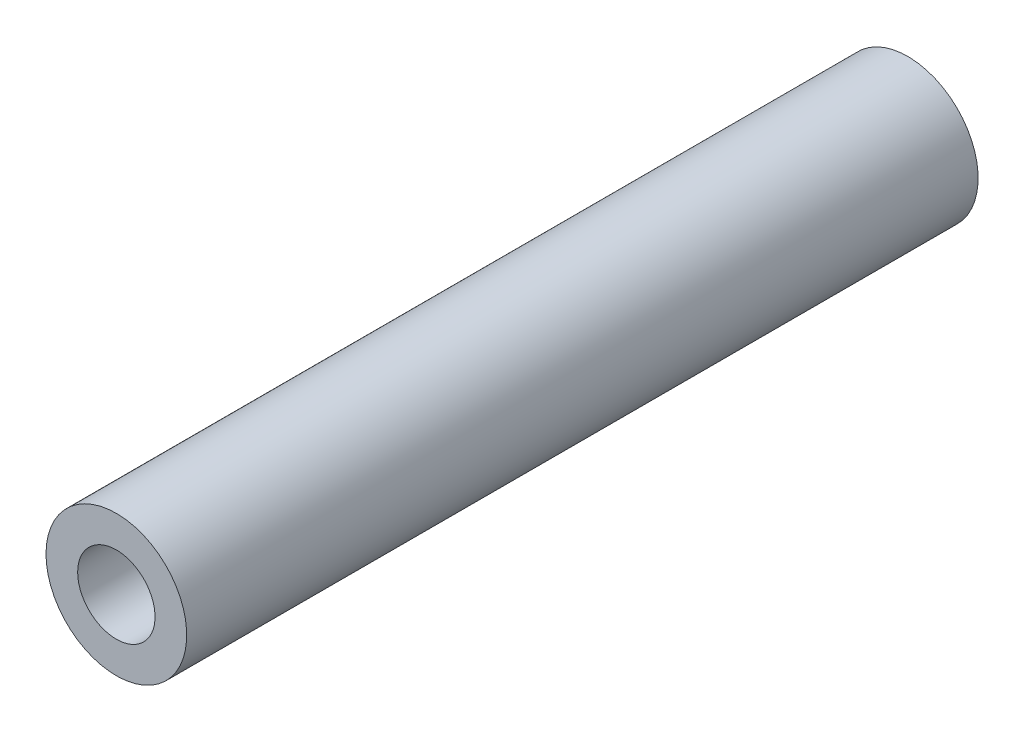
ISO-10303-21;
HEADER;
FILE_DESCRIPTION(('STEP AP214'),'2;1');
FILE_NAME('part.step','',(''),(''),'','','');
FILE_SCHEMA(('AUTOMOTIVE_DESIGN { 1 0 10303 214 1 1 1 1 }'));
ENDSEC;
DATA;
#1=APPLICATION_CONTEXT('core data for automotive mechanical design processes');
#2=APPLICATION_PROTOCOL_DEFINITION('international standard','automotive_design',2000,#1);
#3=PRODUCT_CONTEXT('',#1,'mechanical');
#4=PRODUCT('Part','Part','',(#3));
#5=PRODUCT_RELATED_PRODUCT_CATEGORY('part','',(#4));
#6=PRODUCT_DEFINITION_FORMATION('','',#4);
#7=PRODUCT_DEFINITION_CONTEXT('part definition',#1,'design');
#8=PRODUCT_DEFINITION('design','',#6,#7);
#9=PRODUCT_DEFINITION_SHAPE('','',#8);
#10=(LENGTH_UNIT() NAMED_UNIT(*) SI_UNIT(.MILLI.,.METRE.));
#11=(NAMED_UNIT(*) PLANE_ANGLE_UNIT() SI_UNIT($,.RADIAN.));
#12=(NAMED_UNIT(*) SI_UNIT($,.STERADIAN.) SOLID_ANGLE_UNIT());
#13=UNCERTAINTY_MEASURE_WITH_UNIT(LENGTH_MEASURE(1.E-05),#10,'distance_accuracy_value','');
#14=(GEOMETRIC_REPRESENTATION_CONTEXT(3) GLOBAL_UNCERTAINTY_ASSIGNED_CONTEXT((#13)) GLOBAL_UNIT_ASSIGNED_CONTEXT((#10,
#11,#12)) REPRESENTATION_CONTEXT('',''));
#15=CARTESIAN_POINT('',(0.,0.,0.));
#16=DIRECTION('',(0.,0.,1.));
#17=DIRECTION('',(1.,0.,0.));
#18=AXIS2_PLACEMENT_3D('',#15,#16,#17);
#19=CARTESIAN_POINT('',(0.,0.,45.));
#20=DIRECTION('',(0.,0.,1.));
#21=DIRECTION('',(1.,0.,0.));
#22=AXIS2_PLACEMENT_3D('',#19,#20,#21);
#23=PLANE('',#22);
#24=CARTESIAN_POINT('',(0.,0.,45.));
#25=DIRECTION('',(0.,0.,1.));
#26=DIRECTION('',(1.,0.,0.));
#27=AXIS2_PLACEMENT_3D('',#24,#25,#26);
#28=CIRCLE('',#27,4.);
#29=CARTESIAN_POINT('',(-4.,0.,45.));
#30=VERTEX_POINT('',#29);
#31=EDGE_CURVE('E10',#30,#30,#28,.T.);
#32=ORIENTED_EDGE('',*,*,#31,.T.);
#33=EDGE_LOOP('',(#32));
#34=FACE_BOUND('',#33,.T.);
#35=CARTESIAN_POINT('',(0.,0.,45.));
#36=DIRECTION('',(0.,0.,1.));
#37=DIRECTION('',(1.,0.,0.));
#38=AXIS2_PLACEMENT_3D('',#35,#36,#37);
#39=CIRCLE('',#38,2.2);
#40=CARTESIAN_POINT('',(-2.2,0.,45.));
#41=VERTEX_POINT('',#40);
#42=EDGE_CURVE('E56',#41,#41,#39,.T.);
#43=ORIENTED_EDGE('',*,*,#42,.F.);
#44=EDGE_LOOP('',(#43));
#45=FACE_BOUND('',#44,.T.);
#46=ADVANCED_FACE('F43',(#34,#45),#23,.T.);
#47=CARTESIAN_POINT('',(0.,0.,0.));
#48=DIRECTION('',(0.,0.,1.));
#49=DIRECTION('',(1.,0.,0.));
#50=AXIS2_PLACEMENT_3D('',#47,#48,#49);
#51=PLANE('',#50);
#52=CARTESIAN_POINT('',(0.,0.,0.));
#53=DIRECTION('',(0.,0.,1.));
#54=DIRECTION('',(1.,0.,0.));
#55=AXIS2_PLACEMENT_3D('',#52,#53,#54);
#56=CIRCLE('',#55,4.);
#57=CARTESIAN_POINT('',(-4.,0.,0.));
#58=VERTEX_POINT('',#57);
#59=EDGE_CURVE('E47',#58,#58,#56,.T.);
#60=ORIENTED_EDGE('',*,*,#59,.F.);
#61=EDGE_LOOP('',(#60));
#62=FACE_BOUND('',#61,.T.);
#63=CARTESIAN_POINT('',(0.,0.,0.));
#64=DIRECTION('',(0.,0.,1.));
#65=DIRECTION('',(1.,0.,0.));
#66=AXIS2_PLACEMENT_3D('',#63,#64,#65);
#67=CIRCLE('',#66,2.2);
#68=CARTESIAN_POINT('',(-2.2,0.,0.));
#69=VERTEX_POINT('',#68);
#70=EDGE_CURVE('E58',#69,#69,#67,.T.);
#71=ORIENTED_EDGE('',*,*,#70,.T.);
#72=EDGE_LOOP('',(#71));
#73=FACE_BOUND('',#72,.T.);
#74=ADVANCED_FACE('F70',(#62,#73),#51,.F.);
#75=CARTESIAN_POINT('',(0.,0.,45.));
#76=DIRECTION('',(0.,0.,-1.));
#77=DIRECTION('',(-1.,0.,0.));
#78=AXIS2_PLACEMENT_3D('',#75,#76,#77);
#79=CYLINDRICAL_SURFACE('',#78,4.);
#80=CARTESIAN_POINT('',(-4.,0.,45.));
#81=CARTESIAN_POINT('',(-4.,0.,44.53125));
#82=CARTESIAN_POINT('',(-4.,0.,44.0625));
#83=CARTESIAN_POINT('',(-4.,0.,43.125));
#84=CARTESIAN_POINT('',(-4.,0.,42.65625));
#85=CARTESIAN_POINT('',(-4.,0.,41.71875));
#86=CARTESIAN_POINT('',(-4.,0.,41.25));
#87=CARTESIAN_POINT('',(-4.,0.,40.3125));
#88=CARTESIAN_POINT('',(-4.,0.,39.84375));
#89=CARTESIAN_POINT('',(-4.,0.,38.90625));
#90=CARTESIAN_POINT('',(-4.,0.,38.4375));
#91=CARTESIAN_POINT('',(-4.,0.,37.5));
#92=CARTESIAN_POINT('',(-4.,0.,37.03125));
#93=CARTESIAN_POINT('',(-4.,0.,36.09375));
#94=CARTESIAN_POINT('',(-4.,0.,35.625));
#95=CARTESIAN_POINT('',(-4.,0.,34.6875));
#96=CARTESIAN_POINT('',(-4.,0.,34.21875));
#97=CARTESIAN_POINT('',(-4.,0.,33.28125));
#98=CARTESIAN_POINT('',(-4.,0.,32.8125));
#99=CARTESIAN_POINT('',(-4.,0.,31.875));
#100=CARTESIAN_POINT('',(-4.,0.,31.40625));
#101=CARTESIAN_POINT('',(-4.,0.,30.46875));
#102=CARTESIAN_POINT('',(-4.,0.,30.));
#103=CARTESIAN_POINT('',(-4.,0.,29.0625));
#104=CARTESIAN_POINT('',(-4.,0.,28.59375));
#105=CARTESIAN_POINT('',(-4.,0.,27.65625));
#106=CARTESIAN_POINT('',(-4.,0.,27.1875));
#107=CARTESIAN_POINT('',(-4.,0.,26.25));
#108=CARTESIAN_POINT('',(-4.,0.,25.78125));
#109=CARTESIAN_POINT('',(-4.,0.,24.84375));
#110=CARTESIAN_POINT('',(-4.,0.,24.375));
#111=CARTESIAN_POINT('',(-4.,0.,23.4375));
#112=CARTESIAN_POINT('',(-4.,0.,22.96875));
#113=CARTESIAN_POINT('',(-4.,0.,22.03125));
#114=CARTESIAN_POINT('',(-4.,0.,21.5625));
#115=CARTESIAN_POINT('',(-4.,0.,20.625));
#116=CARTESIAN_POINT('',(-4.,0.,20.15625));
#117=CARTESIAN_POINT('',(-4.,0.,19.21875));
#118=CARTESIAN_POINT('',(-4.,0.,18.75));
#119=CARTESIAN_POINT('',(-4.,0.,17.8125));
#120=CARTESIAN_POINT('',(-4.,0.,17.34375));
#121=CARTESIAN_POINT('',(-4.,0.,16.40625));
#122=CARTESIAN_POINT('',(-4.,0.,15.9375));
#123=CARTESIAN_POINT('',(-4.,0.,15.));
#124=CARTESIAN_POINT('',(-4.,0.,14.53125));
#125=CARTESIAN_POINT('',(-4.,0.,13.59375));
#126=CARTESIAN_POINT('',(-4.,0.,13.125));
#127=CARTESIAN_POINT('',(-4.,0.,12.1875));
#128=CARTESIAN_POINT('',(-4.,0.,11.71875));
#129=CARTESIAN_POINT('',(-4.,0.,10.78125));
#130=CARTESIAN_POINT('',(-4.,0.,10.3125));
#131=CARTESIAN_POINT('',(-4.,0.,9.37499999999999));
#132=CARTESIAN_POINT('',(-4.,0.,8.90624999999999));
#133=CARTESIAN_POINT('',(-4.,0.,7.96874999999999));
#134=CARTESIAN_POINT('',(-4.,0.,7.5));
#135=CARTESIAN_POINT('',(-4.,0.,6.56249999999999));
#136=CARTESIAN_POINT('',(-4.,0.,6.09374999999999));
#137=CARTESIAN_POINT('',(-4.,0.,5.15624999999999));
#138=CARTESIAN_POINT('',(-4.,0.,4.68749999999999));
#139=CARTESIAN_POINT('',(-4.,0.,3.74999999999999));
#140=CARTESIAN_POINT('',(-4.,0.,3.28124999999999));
#141=CARTESIAN_POINT('',(-4.,0.,2.34374999999999));
#142=CARTESIAN_POINT('',(-4.,0.,1.87499999999999));
#143=CARTESIAN_POINT('',(-4.,0.,0.937499999999992));
#144=CARTESIAN_POINT('',(-4.,0.,0.468749999999993));
#145=CARTESIAN_POINT('',(-4.,0.,0.));
#146=B_SPLINE_CURVE_WITH_KNOTS('',3,(#80,#81,#82,#83,#84,#85,#86,#87,#88,#89,#90,#91,#92,#93,
#94,#95,#96,#97,#98,#99,#100,#101,#102,#103,#104,#105,#106,#107,#108,#109,#110,#111,#112,#113,
#114,#115,#116,#117,#118,#119,#120,#121,#122,#123,#124,#125,#126,#127,#128,#129,#130,#131,#132,
#133,#134,#135,#136,#137,#138,#139,#140,#141,#142,#143,#144,#145),.UNSPECIFIED.,.F.,.F.,(4,2,2,
2,2,2,2,2,2,2,2,2,2,2,2,2,2,2,2,2,2,2,2,2,2,2,2,2,2,2,2,2,4),(0.,1.40625,2.8125,
4.21874999999999,5.625,7.03125,8.43749999999999,9.84375,11.25,12.65625,14.0625,15.46875,16.875,
18.28125,19.6875,21.09375,22.5,23.90625,25.3125,26.71875,28.125,29.53125,30.9375,32.34375,33.75,
35.15625,36.5625,37.96875,39.375,40.78125,42.1875,43.59375,45.),.UNSPECIFIED.);
#147=EDGE_CURVE('BSEAM45',#30,#58,#146,.T.);
#148=ORIENTED_EDGE('',*,*,#31,.F.);
#149=ORIENTED_EDGE('',*,*,#59,.T.);
#150=ORIENTED_EDGE('',*,*,#147,.T.);
#151=ORIENTED_EDGE('',*,*,#147,.F.);
#152=EDGE_LOOP('',(#148,#150,#149,#151));
#153=FACE_BOUND('',#152,.T.);
#154=ADVANCED_FACE('F45',(#153),#79,.T.);
#155=CARTESIAN_POINT('',(0.,0.,45.));
#156=DIRECTION('',(0.,0.,-1.));
#157=DIRECTION('',(-1.,0.,0.));
#158=AXIS2_PLACEMENT_3D('',#155,#156,#157);
#159=CYLINDRICAL_SURFACE('',#158,2.2);
#160=CARTESIAN_POINT('',(-2.2,0.,45.));
#161=CARTESIAN_POINT('',(-2.2,0.,44.53125));
#162=CARTESIAN_POINT('',(-2.2,0.,44.0625));
#163=CARTESIAN_POINT('',(-2.2,0.,43.125));
#164=CARTESIAN_POINT('',(-2.2,0.,42.65625));
#165=CARTESIAN_POINT('',(-2.2,0.,41.71875));
#166=CARTESIAN_POINT('',(-2.2,0.,41.25));
#167=CARTESIAN_POINT('',(-2.2,0.,40.3125));
#168=CARTESIAN_POINT('',(-2.2,0.,39.84375));
#169=CARTESIAN_POINT('',(-2.2,0.,38.90625));
#170=CARTESIAN_POINT('',(-2.2,0.,38.4375));
#171=CARTESIAN_POINT('',(-2.2,0.,37.5));
#172=CARTESIAN_POINT('',(-2.2,0.,37.03125));
#173=CARTESIAN_POINT('',(-2.2,0.,36.09375));
#174=CARTESIAN_POINT('',(-2.2,0.,35.625));
#175=CARTESIAN_POINT('',(-2.2,0.,34.6875));
#176=CARTESIAN_POINT('',(-2.2,0.,34.21875));
#177=CARTESIAN_POINT('',(-2.2,0.,33.28125));
#178=CARTESIAN_POINT('',(-2.2,0.,32.8125));
#179=CARTESIAN_POINT('',(-2.2,0.,31.875));
#180=CARTESIAN_POINT('',(-2.2,0.,31.40625));
#181=CARTESIAN_POINT('',(-2.2,0.,30.46875));
#182=CARTESIAN_POINT('',(-2.2,0.,30.));
#183=CARTESIAN_POINT('',(-2.2,0.,29.0625));
#184=CARTESIAN_POINT('',(-2.2,0.,28.59375));
#185=CARTESIAN_POINT('',(-2.2,0.,27.65625));
#186=CARTESIAN_POINT('',(-2.2,0.,27.1875));
#187=CARTESIAN_POINT('',(-2.2,0.,26.25));
#188=CARTESIAN_POINT('',(-2.2,0.,25.78125));
#189=CARTESIAN_POINT('',(-2.2,0.,24.84375));
#190=CARTESIAN_POINT('',(-2.2,0.,24.375));
#191=CARTESIAN_POINT('',(-2.2,0.,23.4375));
#192=CARTESIAN_POINT('',(-2.2,0.,22.96875));
#193=CARTESIAN_POINT('',(-2.2,0.,22.03125));
#194=CARTESIAN_POINT('',(-2.2,0.,21.5625));
#195=CARTESIAN_POINT('',(-2.2,0.,20.625));
#196=CARTESIAN_POINT('',(-2.2,0.,20.15625));
#197=CARTESIAN_POINT('',(-2.2,0.,19.21875));
#198=CARTESIAN_POINT('',(-2.2,0.,18.75));
#199=CARTESIAN_POINT('',(-2.2,0.,17.8125));
#200=CARTESIAN_POINT('',(-2.2,0.,17.34375));
#201=CARTESIAN_POINT('',(-2.2,0.,16.40625));
#202=CARTESIAN_POINT('',(-2.2,0.,15.9375));
#203=CARTESIAN_POINT('',(-2.2,0.,15.));
#204=CARTESIAN_POINT('',(-2.2,0.,14.53125));
#205=CARTESIAN_POINT('',(-2.2,0.,13.59375));
#206=CARTESIAN_POINT('',(-2.2,0.,13.125));
#207=CARTESIAN_POINT('',(-2.2,0.,12.1875));
#208=CARTESIAN_POINT('',(-2.2,0.,11.71875));
#209=CARTESIAN_POINT('',(-2.2,0.,10.78125));
#210=CARTESIAN_POINT('',(-2.2,0.,10.3125));
#211=CARTESIAN_POINT('',(-2.2,0.,9.37499999999999));
#212=CARTESIAN_POINT('',(-2.2,0.,8.90624999999999));
#213=CARTESIAN_POINT('',(-2.2,0.,7.96874999999999));
#214=CARTESIAN_POINT('',(-2.2,0.,7.5));
#215=CARTESIAN_POINT('',(-2.2,0.,6.56249999999999));
#216=CARTESIAN_POINT('',(-2.2,0.,6.09374999999999));
#217=CARTESIAN_POINT('',(-2.2,0.,5.15624999999999));
#218=CARTESIAN_POINT('',(-2.2,0.,4.68749999999999));
#219=CARTESIAN_POINT('',(-2.2,0.,3.74999999999999));
#220=CARTESIAN_POINT('',(-2.2,0.,3.28124999999999));
#221=CARTESIAN_POINT('',(-2.2,0.,2.34374999999999));
#222=CARTESIAN_POINT('',(-2.2,0.,1.87499999999999));
#223=CARTESIAN_POINT('',(-2.2,0.,0.937499999999992));
#224=CARTESIAN_POINT('',(-2.2,0.,0.468749999999993));
#225=CARTESIAN_POINT('',(-2.2,0.,0.));
#226=B_SPLINE_CURVE_WITH_KNOTS('',3,(#160,#161,#162,#163,#164,#165,#166,#167,#168,#169,#170,
#171,#172,#173,#174,#175,#176,#177,#178,#179,#180,#181,#182,#183,#184,#185,#186,#187,#188,#189,
#190,#191,#192,#193,#194,#195,#196,#197,#198,#199,#200,#201,#202,#203,#204,#205,#206,#207,#208,
#209,#210,#211,#212,#213,#214,#215,#216,#217,#218,#219,#220,#221,#222,#223,#224,#225),
.UNSPECIFIED.,.F.,.F.,(4,2,2,2,2,2,2,2,2,2,2,2,2,2,2,2,2,2,2,2,2,2,2,2,2,2,2,2,2,2,2,2,4),(0.,
1.40625,2.8125,4.21874999999999,5.625,7.03125,8.43749999999999,9.84375,11.25,12.65625,14.0625,
15.46875,16.875,18.28125,19.6875,21.09375,22.5,23.90625,25.3125,26.71875,28.125,29.53125,
30.9375,32.34375,33.75,35.15625,36.5625,37.96875,39.375,40.78125,42.1875,43.59375,45.),.UNSPECIFIED.);
#227=EDGE_CURVE('BSEAM66',#41,#69,#226,.T.);
#228=ORIENTED_EDGE('',*,*,#42,.T.);
#229=ORIENTED_EDGE('',*,*,#70,.F.);
#230=ORIENTED_EDGE('',*,*,#227,.T.);
#231=ORIENTED_EDGE('',*,*,#227,.F.);
#232=EDGE_LOOP('',(#228,#230,#229,#231));
#233=FACE_BOUND('',#232,.T.);
#234=ADVANCED_FACE('F66',(#233),#159,.F.);
#235=CLOSED_SHELL('',(#46,#74,#154,#234));
#236=MANIFOLD_SOLID_BREP('B2',#235);
#237=ADVANCED_BREP_SHAPE_REPRESENTATION('',(#18,#236),#14);
#238=SHAPE_DEFINITION_REPRESENTATION(#9,#237);
ENDSEC;
END-ISO-10303-21;
